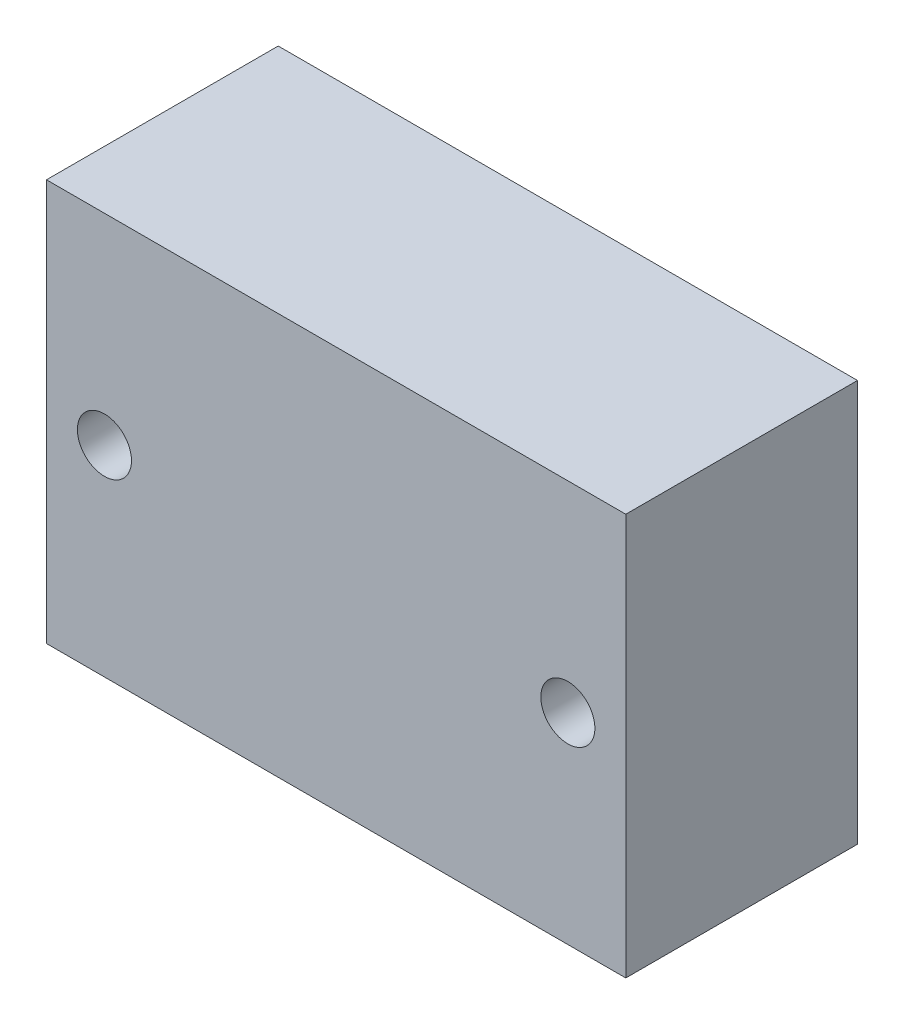
ISO-10303-21;
HEADER;
FILE_DESCRIPTION(('STEP AP214'),'2;1');
FILE_NAME('part.step','',(''),(''),'','','');
FILE_SCHEMA(('AUTOMOTIVE_DESIGN { 1 0 10303 214 1 1 1 1 }'));
ENDSEC;
DATA;
#1=APPLICATION_CONTEXT('core data for automotive mechanical design processes');
#2=APPLICATION_PROTOCOL_DEFINITION('international standard','automotive_design',2000,#1);
#3=PRODUCT_CONTEXT('',#1,'mechanical');
#4=PRODUCT('Part','Part','',(#3));
#5=PRODUCT_RELATED_PRODUCT_CATEGORY('part','',(#4));
#6=PRODUCT_DEFINITION_FORMATION('','',#4);
#7=PRODUCT_DEFINITION_CONTEXT('part definition',#1,'design');
#8=PRODUCT_DEFINITION('design','',#6,#7);
#9=PRODUCT_DEFINITION_SHAPE('','',#8);
#10=(LENGTH_UNIT() NAMED_UNIT(*) SI_UNIT(.MILLI.,.METRE.));
#11=(NAMED_UNIT(*) PLANE_ANGLE_UNIT() SI_UNIT($,.RADIAN.));
#12=(NAMED_UNIT(*) SI_UNIT($,.STERADIAN.) SOLID_ANGLE_UNIT());
#13=UNCERTAINTY_MEASURE_WITH_UNIT(LENGTH_MEASURE(1.E-05),#10,'distance_accuracy_value','');
#14=(GEOMETRIC_REPRESENTATION_CONTEXT(3) GLOBAL_UNCERTAINTY_ASSIGNED_CONTEXT((#13)) GLOBAL_UNIT_ASSIGNED_CONTEXT((#10,
#11,#12)) REPRESENTATION_CONTEXT('',''));
#15=CARTESIAN_POINT('',(0.,0.,0.));
#16=DIRECTION('',(0.,0.,1.));
#17=DIRECTION('',(1.,0.,0.));
#18=AXIS2_PLACEMENT_3D('',#15,#16,#17);
#19=CARTESIAN_POINT('',(0.,0.,30.));
#20=DIRECTION('',(0.,0.,1.));
#21=DIRECTION('',(1.,0.,0.));
#22=AXIS2_PLACEMENT_3D('',#19,#20,#21);
#23=PLANE('',#22);
#24=CARTESIAN_POINT('',(7.5,-26.,30.));
#25=DIRECTION('',(0.,0.,1.));
#26=DIRECTION('',(1.,0.,0.));
#27=AXIS2_PLACEMENT_3D('',#24,#25,#26);
#28=CIRCLE('',#27,3.5);
#29=CARTESIAN_POINT('',(11.,-26.,30.));
#30=VERTEX_POINT('',#29);
#31=EDGE_CURVE('E104',#30,#30,#28,.T.);
#32=ORIENTED_EDGE('',*,*,#31,.F.);
#33=EDGE_LOOP('',(#32));
#34=FACE_BOUND('',#33,.T.);
#35=DIRECTION('',(0.,-1.,0.));
#36=VECTOR('',#35,1.);
#37=CARTESIAN_POINT('',(0.,0.,30.));
#38=LINE('',#37,#36);
#39=CARTESIAN_POINT('',(0.,0.,30.));
#40=VERTEX_POINT('',#39);
#41=CARTESIAN_POINT('',(0.,-52.,30.));
#42=VERTEX_POINT('',#41);
#43=EDGE_CURVE('E89',#40,#42,#38,.T.);
#44=ORIENTED_EDGE('',*,*,#43,.T.);
#45=DIRECTION('',(1.,0.,0.));
#46=VECTOR('',#45,1.);
#47=CARTESIAN_POINT('',(0.,-52.,30.));
#48=LINE('',#47,#46);
#49=CARTESIAN_POINT('',(75.,-52.,30.));
#50=VERTEX_POINT('',#49);
#51=EDGE_CURVE('E84',#42,#50,#48,.T.);
#52=ORIENTED_EDGE('',*,*,#51,.T.);
#53=DIRECTION('',(0.,1.,0.));
#54=VECTOR('',#53,1.);
#55=CARTESIAN_POINT('',(75.,0.,30.));
#56=LINE('',#55,#54);
#57=CARTESIAN_POINT('',(75.,0.,30.));
#58=VERTEX_POINT('',#57);
#59=EDGE_CURVE('E87',#50,#58,#56,.T.);
#60=ORIENTED_EDGE('',*,*,#59,.T.);
#61=DIRECTION('',(-1.,0.,0.));
#62=VECTOR('',#61,1.);
#63=CARTESIAN_POINT('',(0.,0.,30.));
#64=LINE('',#63,#62);
#65=EDGE_CURVE('E54',#58,#40,#64,.T.);
#66=ORIENTED_EDGE('',*,*,#65,.T.);
#67=EDGE_LOOP('',(#44,#52,#60,#66));
#68=FACE_BOUND('',#67,.T.);
#69=CARTESIAN_POINT('',(67.5,-26.,30.));
#70=DIRECTION('',(0.,0.,1.));
#71=DIRECTION('',(-1.,0.,0.));
#72=AXIS2_PLACEMENT_3D('',#69,#70,#71);
#73=CIRCLE('',#72,3.50000000000001);
#74=CARTESIAN_POINT('',(64.,-26.,30.));
#75=VERTEX_POINT('',#74);
#76=EDGE_CURVE('E119',#75,#75,#73,.T.);
#77=ORIENTED_EDGE('',*,*,#76,.F.);
#78=EDGE_LOOP('',(#77));
#79=FACE_BOUND('',#78,.T.);
#80=ADVANCED_FACE('F37',(#34,#68,#79),#23,.T.);
#81=CARTESIAN_POINT('',(0.,0.,0.));
#82=DIRECTION('',(0.,0.,1.));
#83=DIRECTION('',(1.,0.,0.));
#84=AXIS2_PLACEMENT_3D('',#81,#82,#83);
#85=PLANE('',#84);
#86=DIRECTION('',(0.,-1.,0.));
#87=VECTOR('',#86,1.);
#88=CARTESIAN_POINT('',(0.,0.,0.));
#89=LINE('',#88,#87);
#90=CARTESIAN_POINT('',(0.,0.,0.));
#91=VERTEX_POINT('',#90);
#92=CARTESIAN_POINT('',(0.,-52.,0.));
#93=VERTEX_POINT('',#92);
#94=EDGE_CURVE('E101',#91,#93,#89,.T.);
#95=ORIENTED_EDGE('',*,*,#94,.F.);
#96=DIRECTION('',(-1.,0.,0.));
#97=VECTOR('',#96,1.);
#98=CARTESIAN_POINT('',(0.,0.,0.));
#99=LINE('',#98,#97);
#100=CARTESIAN_POINT('',(75.,0.,0.));
#101=VERTEX_POINT('',#100);
#102=EDGE_CURVE('E77',#101,#91,#99,.T.);
#103=ORIENTED_EDGE('',*,*,#102,.F.);
#104=DIRECTION('',(0.,1.,0.));
#105=VECTOR('',#104,1.);
#106=CARTESIAN_POINT('',(75.,0.,0.));
#107=LINE('',#106,#105);
#108=CARTESIAN_POINT('',(75.,-52.,0.));
#109=VERTEX_POINT('',#108);
#110=EDGE_CURVE('E71',#109,#101,#107,.T.);
#111=ORIENTED_EDGE('',*,*,#110,.F.);
#112=DIRECTION('',(1.,0.,0.));
#113=VECTOR('',#112,1.);
#114=CARTESIAN_POINT('',(0.,-52.,0.));
#115=LINE('',#114,#113);
#116=EDGE_CURVE('E93',#93,#109,#115,.T.);
#117=ORIENTED_EDGE('',*,*,#116,.F.);
#118=EDGE_LOOP('',(#95,#103,#111,#117));
#119=FACE_BOUND('',#118,.T.);
#120=CARTESIAN_POINT('',(7.5,-26.,0.));
#121=DIRECTION('',(0.,0.,1.));
#122=DIRECTION('',(1.,0.,0.));
#123=AXIS2_PLACEMENT_3D('',#120,#121,#122);
#124=CIRCLE('',#123,3.5);
#125=CARTESIAN_POINT('',(11.,-26.,0.));
#126=VERTEX_POINT('',#125);
#127=EDGE_CURVE('E116',#126,#126,#124,.T.);
#128=ORIENTED_EDGE('',*,*,#127,.T.);
#129=EDGE_LOOP('',(#128));
#130=FACE_BOUND('',#129,.T.);
#131=CARTESIAN_POINT('',(67.5,-26.,0.));
#132=DIRECTION('',(0.,0.,1.));
#133=DIRECTION('',(-1.,0.,0.));
#134=AXIS2_PLACEMENT_3D('',#131,#132,#133);
#135=CIRCLE('',#134,3.50000000000001);
#136=CARTESIAN_POINT('',(64.,-26.,0.));
#137=VERTEX_POINT('',#136);
#138=EDGE_CURVE('E122',#137,#137,#135,.T.);
#139=ORIENTED_EDGE('',*,*,#138,.T.);
#140=EDGE_LOOP('',(#139));
#141=FACE_BOUND('',#140,.T.);
#142=ADVANCED_FACE('F112',(#119,#130,#141),#85,.F.);
#143=CARTESIAN_POINT('',(0.,0.,30.));
#144=DIRECTION('',(1.,0.,0.));
#145=DIRECTION('',(0.,1.,0.));
#146=AXIS2_PLACEMENT_3D('',#143,#144,#145);
#147=PLANE('',#146);
#148=ORIENTED_EDGE('',*,*,#94,.T.);
#149=DIRECTION('',(0.,0.,-1.));
#150=VECTOR('',#149,1.);
#151=CARTESIAN_POINT('',(0.,-52.,30.));
#152=LINE('',#151,#150);
#153=EDGE_CURVE('E11',#42,#93,#152,.T.);
#154=ORIENTED_EDGE('',*,*,#153,.F.);
#155=ORIENTED_EDGE('',*,*,#43,.F.);
#156=DIRECTION('',(0.,0.,-1.));
#157=VECTOR('',#156,1.);
#158=CARTESIAN_POINT('',(0.,0.,30.));
#159=LINE('',#158,#157);
#160=EDGE_CURVE('E97',#40,#91,#159,.T.);
#161=ORIENTED_EDGE('',*,*,#160,.T.);
#162=EDGE_LOOP('',(#148,#154,#155,#161));
#163=FACE_BOUND('',#162,.T.);
#164=ADVANCED_FACE('F39',(#163),#147,.F.);
#165=CARTESIAN_POINT('',(0.,-52.,30.));
#166=DIRECTION('',(0.,1.,0.));
#167=DIRECTION('',(0.,0.,1.));
#168=AXIS2_PLACEMENT_3D('',#165,#166,#167);
#169=PLANE('',#168);
#170=ORIENTED_EDGE('',*,*,#116,.T.);
#171=DIRECTION('',(0.,0.,-1.));
#172=VECTOR('',#171,1.);
#173=CARTESIAN_POINT('',(75.,-52.,30.));
#174=LINE('',#173,#172);
#175=EDGE_CURVE('E46',#50,#109,#174,.T.);
#176=ORIENTED_EDGE('',*,*,#175,.F.);
#177=ORIENTED_EDGE('',*,*,#51,.F.);
#178=ORIENTED_EDGE('',*,*,#153,.T.);
#179=EDGE_LOOP('',(#170,#176,#177,#178));
#180=FACE_BOUND('',#179,.T.);
#181=ADVANCED_FACE('F92',(#180),#169,.F.);
#182=CARTESIAN_POINT('',(75.,0.,30.));
#183=DIRECTION('',(-1.,0.,0.));
#184=DIRECTION('',(0.,0.,1.));
#185=AXIS2_PLACEMENT_3D('',#182,#183,#184);
#186=PLANE('',#185);
#187=ORIENTED_EDGE('',*,*,#110,.T.);
#188=DIRECTION('',(0.,0.,-1.));
#189=VECTOR('',#188,1.);
#190=CARTESIAN_POINT('',(75.,0.,30.));
#191=LINE('',#190,#189);
#192=EDGE_CURVE('E94',#58,#101,#191,.T.);
#193=ORIENTED_EDGE('',*,*,#192,.F.);
#194=ORIENTED_EDGE('',*,*,#59,.F.);
#195=ORIENTED_EDGE('',*,*,#175,.T.);
#196=EDGE_LOOP('',(#187,#193,#194,#195));
#197=FACE_BOUND('',#196,.T.);
#198=ADVANCED_FACE('F95',(#197),#186,.F.);
#199=CARTESIAN_POINT('',(0.,0.,30.));
#200=DIRECTION('',(0.,-1.,0.));
#201=DIRECTION('',(0.,0.,-1.));
#202=AXIS2_PLACEMENT_3D('',#199,#200,#201);
#203=PLANE('',#202);
#204=ORIENTED_EDGE('',*,*,#102,.T.);
#205=ORIENTED_EDGE('',*,*,#160,.F.);
#206=ORIENTED_EDGE('',*,*,#65,.F.);
#207=ORIENTED_EDGE('',*,*,#192,.T.);
#208=EDGE_LOOP('',(#204,#205,#206,#207));
#209=FACE_BOUND('',#208,.T.);
#210=ADVANCED_FACE('F109',(#209),#203,.F.);
#211=CARTESIAN_POINT('',(7.5,-26.,30.));
#212=DIRECTION('',(0.,0.,-1.));
#213=DIRECTION('',(-1.,0.,0.));
#214=AXIS2_PLACEMENT_3D('',#211,#212,#213);
#215=CYLINDRICAL_SURFACE('',#214,3.5);
#216=ORIENTED_EDGE('',*,*,#31,.T.);
#217=EDGE_LOOP('',(#216));
#218=FACE_BOUND('',#217,.T.);
#219=ORIENTED_EDGE('',*,*,#127,.F.);
#220=EDGE_LOOP('',(#219));
#221=FACE_BOUND('',#220,.T.);
#222=ADVANCED_FACE('F139',(#218,#221),#215,.F.);
#223=CARTESIAN_POINT('',(67.5,-26.,30.));
#224=DIRECTION('',(0.,0.,-1.));
#225=DIRECTION('',(-1.,0.,0.));
#226=AXIS2_PLACEMENT_3D('',#223,#224,#225);
#227=CYLINDRICAL_SURFACE('',#226,3.50000000000001);
#228=ORIENTED_EDGE('',*,*,#76,.T.);
#229=EDGE_LOOP('',(#228));
#230=FACE_BOUND('',#229,.T.);
#231=ORIENTED_EDGE('',*,*,#138,.F.);
#232=EDGE_LOOP('',(#231));
#233=FACE_BOUND('',#232,.T.);
#234=ADVANCED_FACE('F128',(#230,#233),#227,.F.);
#235=CLOSED_SHELL('',(#80,#142,#164,#181,#198,#210,#222,#234));
#236=MANIFOLD_SOLID_BREP('B2',#235);
#237=ADVANCED_BREP_SHAPE_REPRESENTATION('',(#18,#236),#14);
#238=SHAPE_DEFINITION_REPRESENTATION(#9,#237);
ENDSEC;
END-ISO-10303-21;
